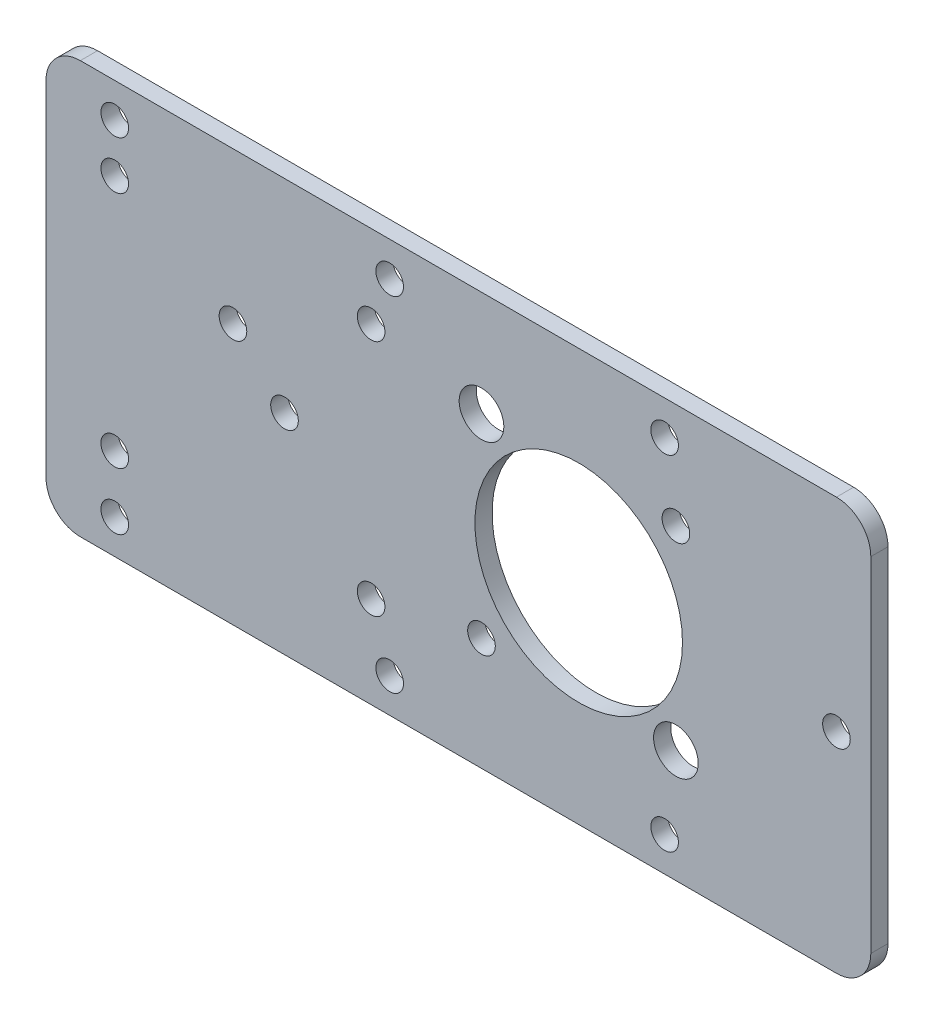
ISO-10303-21;
HEADER;
FILE_DESCRIPTION(('STEP AP214'),'2;1');
FILE_NAME('part.step','',(''),(''),'','','');
FILE_SCHEMA(('AUTOMOTIVE_DESIGN { 1 0 10303 214 1 1 1 1 }'));
ENDSEC;
DATA;
#1=APPLICATION_CONTEXT('core data for automotive mechanical design processes');
#2=APPLICATION_PROTOCOL_DEFINITION('international standard','automotive_design',2000,#1);
#3=PRODUCT_CONTEXT('',#1,'mechanical');
#4=PRODUCT('Part','Part','',(#3));
#5=PRODUCT_RELATED_PRODUCT_CATEGORY('part','',(#4));
#6=PRODUCT_DEFINITION_FORMATION('','',#4);
#7=PRODUCT_DEFINITION_CONTEXT('part definition',#1,'design');
#8=PRODUCT_DEFINITION('design','',#6,#7);
#9=PRODUCT_DEFINITION_SHAPE('','',#8);
#10=(LENGTH_UNIT() NAMED_UNIT(*) SI_UNIT(.MILLI.,.METRE.));
#11=(NAMED_UNIT(*) PLANE_ANGLE_UNIT() SI_UNIT($,.RADIAN.));
#12=(NAMED_UNIT(*) SI_UNIT($,.STERADIAN.) SOLID_ANGLE_UNIT());
#13=UNCERTAINTY_MEASURE_WITH_UNIT(LENGTH_MEASURE(1.E-05),#10,'distance_accuracy_value','');
#14=(GEOMETRIC_REPRESENTATION_CONTEXT(3) GLOBAL_UNCERTAINTY_ASSIGNED_CONTEXT((#13)) GLOBAL_UNIT_ASSIGNED_CONTEXT((#10,
#11,#12)) REPRESENTATION_CONTEXT('',''));
#15=CARTESIAN_POINT('',(0.,0.,0.));
#16=DIRECTION('',(0.,0.,1.));
#17=DIRECTION('',(1.,0.,0.));
#18=AXIS2_PLACEMENT_3D('',#15,#16,#17);
#19=CARTESIAN_POINT('',(-18.4194587961381,9.85973484361682,3.175));
#20=DIRECTION('',(0.,0.,1.));
#21=DIRECTION('',(1.,0.,0.));
#22=AXIS2_PLACEMENT_3D('',#19,#20,#21);
#23=PLANE('',#22);
#24=CARTESIAN_POINT('',(91.6160534460001,24.3331596898449,3.175));
#25=DIRECTION('',(0.,0.,1.));
#26=DIRECTION('',(1.,0.,0.));
#27=AXIS2_PLACEMENT_3D('',#24,#25,#26);
#28=CIRCLE('',#27,4.12749999999999);
#29=CARTESIAN_POINT('',(95.7435534460001,24.3331596898449,3.175));
#30=VERTEX_POINT('',#29);
#31=EDGE_CURVE('E278',#30,#30,#28,.T.);
#32=ORIENTED_EDGE('',*,*,#31,.F.);
#33=EDGE_LOOP('',(#32));
#34=FACE_BOUND('',#33,.T.);
#35=CARTESIAN_POINT('',(55.6950289617236,60.2541841741216,3.175));
#36=DIRECTION('',(0.,0.,1.));
#37=DIRECTION('',(1.,0.,0.));
#38=AXIS2_PLACEMENT_3D('',#35,#36,#37);
#39=CIRCLE('',#38,4.1275);
#40=CARTESIAN_POINT('',(59.8225289617236,60.2541841741216,3.175));
#41=VERTEX_POINT('',#40);
#42=EDGE_CURVE('E266',#41,#41,#39,.T.);
#43=ORIENTED_EDGE('',*,*,#42,.F.);
#44=EDGE_LOOP('',(#43));
#45=FACE_BOUND('',#44,.T.);
#46=CARTESIAN_POINT('',(38.7305412038619,9.85973484361682,3.175));
#47=DIRECTION('',(0.,0.,1.));
#48=DIRECTION('',(1.,0.,0.));
#49=AXIS2_PLACEMENT_3D('',#46,#47,#48);
#50=CIRCLE('',#49,2.5527);
#51=CARTESIAN_POINT('',(41.2832412038619,9.85973484361682,3.175));
#52=VERTEX_POINT('',#51);
#53=EDGE_CURVE('E254',#52,#52,#50,.T.);
#54=ORIENTED_EDGE('',*,*,#53,.F.);
#55=EDGE_LOOP('',(#54));
#56=FACE_BOUND('',#55,.T.);
#57=CARTESIAN_POINT('',(-12.0694587961381,20.4336742758977,3.175));
#58=DIRECTION('',(0.,0.,1.));
#59=DIRECTION('',(1.,0.,0.));
#60=AXIS2_PLACEMENT_3D('',#57,#58,#59);
#61=CIRCLE('',#60,2.5527);
#62=CARTESIAN_POINT('',(-9.51675879613812,20.4336742758977,3.175));
#63=VERTEX_POINT('',#62);
#64=EDGE_CURVE('E242',#63,#63,#61,.T.);
#65=ORIENTED_EDGE('',*,*,#64,.F.);
#66=EDGE_LOOP('',(#65));
#67=FACE_BOUND('',#66,.T.);
#68=CARTESIAN_POINT('',(9.77419288939169,51.7273950078619,3.175));
#69=DIRECTION('',(0.,0.,1.));
#70=DIRECTION('',(1.,0.,0.));
#71=AXIS2_PLACEMENT_3D('',#68,#69,#70);
#72=CIRCLE('',#71,2.5527);
#73=CARTESIAN_POINT('',(12.3268928893917,51.7273950078619,3.175));
#74=VERTEX_POINT('',#73);
#75=EDGE_CURVE('E230',#74,#74,#72,.T.);
#76=ORIENTED_EDGE('',*,*,#75,.F.);
#77=EDGE_LOOP('',(#76));
#78=FACE_BOUND('',#77,.T.);
#79=CARTESIAN_POINT('',(38.7305412038619,73.3597348436168,3.175));
#80=DIRECTION('',(0.,0.,1.));
#81=DIRECTION('',(1.,0.,0.));
#82=AXIS2_PLACEMENT_3D('',#79,#80,#81);
#83=CIRCLE('',#82,2.55269999999999);
#84=CARTESIAN_POINT('',(41.2832412038619,73.3597348436168,3.175));
#85=VERTEX_POINT('',#84);
#86=EDGE_CURVE('E218',#85,#85,#83,.T.);
#87=ORIENTED_EDGE('',*,*,#86,.F.);
#88=EDGE_LOOP('',(#87));
#89=FACE_BOUND('',#88,.T.);
#90=CARTESIAN_POINT('',(-12.0694587961381,64.4273950078619,3.175));
#91=DIRECTION('',(0.,0.,1.));
#92=DIRECTION('',(1.,0.,0.));
#93=AXIS2_PLACEMENT_3D('',#90,#91,#92);
#94=CIRCLE('',#93,2.55269999999999);
#95=CARTESIAN_POINT('',(-9.51675879613813,64.4273950078619,3.175));
#96=VERTEX_POINT('',#95);
#97=EDGE_CURVE('E206',#96,#96,#94,.T.);
#98=ORIENTED_EDGE('',*,*,#97,.F.);
#99=EDGE_LOOP('',(#98));
#100=FACE_BOUND('',#99,.T.);
#101=CARTESIAN_POINT('',(-12.0694587961381,9.85973484361682,3.175));
#102=DIRECTION('',(0.,0.,1.));
#103=DIRECTION('',(1.,0.,0.));
#104=AXIS2_PLACEMENT_3D('',#101,#102,#103);
#105=CIRCLE('',#104,2.5527);
#106=CARTESIAN_POINT('',(-9.51675879613812,9.85973484361682,3.175));
#107=VERTEX_POINT('',#106);
#108=EDGE_CURVE('E194',#107,#107,#105,.T.);
#109=ORIENTED_EDGE('',*,*,#108,.F.);
#110=EDGE_LOOP('',(#109));
#111=FACE_BOUND('',#110,.T.);
#112=CARTESIAN_POINT('',(89.5305412038619,9.85973484361682,3.175));
#113=DIRECTION('',(0.,0.,1.));
#114=DIRECTION('',(1.,0.,0.));
#115=AXIS2_PLACEMENT_3D('',#112,#113,#114);
#116=CIRCLE('',#115,2.55269999999998);
#117=CARTESIAN_POINT('',(92.0832412038618,9.85973484361682,3.175));
#118=VERTEX_POINT('',#117);
#119=EDGE_CURVE('E140',#118,#118,#116,.T.);
#120=ORIENTED_EDGE('',*,*,#119,.F.);
#121=EDGE_LOOP('',(#120));
#122=FACE_BOUND('',#121,.T.);
#123=CARTESIAN_POINT('',(-18.4194587961381,9.85973484361682,3.175));
#124=DIRECTION('',(0.,0.,1.));
#125=DIRECTION('',(1.,0.,0.));
#126=AXIS2_PLACEMENT_3D('',#123,#124,#125);
#127=CIRCLE('',#126,6.35);
#128=CARTESIAN_POINT('',(-24.7694587961381,9.85973484361682,3.175));
#129=VERTEX_POINT('',#128);
#130=CARTESIAN_POINT('',(-18.4194587961381,3.50973484361682,3.175));
#131=VERTEX_POINT('',#130);
#132=EDGE_CURVE('E151',#129,#131,#127,.T.);
#133=ORIENTED_EDGE('',*,*,#132,.T.);
#134=DIRECTION('',(1.,0.,0.));
#135=VECTOR('',#134,1.);
#136=CARTESIAN_POINT('',(-18.4194587961381,3.50973484361682,3.175));
#137=LINE('',#136,#135);
#138=CARTESIAN_POINT('',(121.280541203862,3.50973484361682,3.175));
#139=VERTEX_POINT('',#138);
#140=EDGE_CURVE('E99',#131,#139,#137,.T.);
#141=ORIENTED_EDGE('',*,*,#140,.T.);
#142=CARTESIAN_POINT('',(121.280541203862,9.85973484361682,3.175));
#143=DIRECTION('',(0.,0.,1.));
#144=DIRECTION('',(1.,0.,0.));
#145=AXIS2_PLACEMENT_3D('',#142,#143,#144);
#146=CIRCLE('',#145,6.34999999999999);
#147=CARTESIAN_POINT('',(127.630541203862,9.85973484361682,3.175));
#148=VERTEX_POINT('',#147);
#149=EDGE_CURVE('E166',#139,#148,#146,.T.);
#150=ORIENTED_EDGE('',*,*,#149,.T.);
#151=DIRECTION('',(0.,1.,0.));
#152=VECTOR('',#151,1.);
#153=CARTESIAN_POINT('',(127.630541203862,73.3597348436168,3.175));
#154=LINE('',#153,#152);
#155=CARTESIAN_POINT('',(127.630541203862,73.3597348436168,3.175));
#156=VERTEX_POINT('',#155);
#157=EDGE_CURVE('E179',#148,#156,#154,.T.);
#158=ORIENTED_EDGE('',*,*,#157,.T.);
#159=CARTESIAN_POINT('',(121.280541203862,73.3597348436168,3.175));
#160=DIRECTION('',(0.,0.,1.));
#161=DIRECTION('',(-1.,0.,0.));
#162=AXIS2_PLACEMENT_3D('',#159,#160,#161);
#163=CIRCLE('',#162,6.34999999999999);
#164=CARTESIAN_POINT('',(121.280541203862,79.7097348436168,3.175));
#165=VERTEX_POINT('',#164);
#166=EDGE_CURVE('E118',#156,#165,#163,.T.);
#167=ORIENTED_EDGE('',*,*,#166,.T.);
#168=DIRECTION('',(-1.,0.,0.));
#169=VECTOR('',#168,1.);
#170=CARTESIAN_POINT('',(-18.4194587961381,79.7097348436168,3.175));
#171=LINE('',#170,#169);
#172=CARTESIAN_POINT('',(-18.4194587961381,79.7097348436168,3.175));
#173=VERTEX_POINT('',#172);
#174=EDGE_CURVE('E112',#165,#173,#171,.T.);
#175=ORIENTED_EDGE('',*,*,#174,.T.);
#176=CARTESIAN_POINT('',(-18.4194587961381,73.3597348436168,3.175));
#177=DIRECTION('',(0.,0.,1.));
#178=DIRECTION('',(-1.,0.,0.));
#179=AXIS2_PLACEMENT_3D('',#176,#177,#178);
#180=CIRCLE('',#179,6.35);
#181=CARTESIAN_POINT('',(-24.7694587961381,73.3597348436168,3.175));
#182=VERTEX_POINT('',#181);
#183=EDGE_CURVE('E116',#173,#182,#180,.T.);
#184=ORIENTED_EDGE('',*,*,#183,.T.);
#185=DIRECTION('',(0.,-1.,0.));
#186=VECTOR('',#185,1.);
#187=CARTESIAN_POINT('',(-24.7694587961381,9.85973484361682,3.175));
#188=LINE('',#187,#186);
#189=EDGE_CURVE('E56',#182,#129,#188,.T.);
#190=ORIENTED_EDGE('',*,*,#189,.T.);
#191=EDGE_LOOP('',(#133,#141,#150,#158,#167,#175,#184,#190));
#192=FACE_BOUND('',#191,.T.);
#193=CARTESIAN_POINT('',(-12.0694587961381,73.3597348436168,3.175));
#194=DIRECTION('',(0.,0.,1.));
#195=DIRECTION('',(1.,0.,0.));
#196=AXIS2_PLACEMENT_3D('',#193,#194,#195);
#197=CIRCLE('',#196,2.55269999999998);
#198=CARTESIAN_POINT('',(-9.51675879613814,73.3597348436168,3.175));
#199=VERTEX_POINT('',#198);
#200=EDGE_CURVE('E188',#199,#199,#197,.T.);
#201=ORIENTED_EDGE('',*,*,#200,.F.);
#202=EDGE_LOOP('',(#201));
#203=FACE_BOUND('',#202,.T.);
#204=CARTESIAN_POINT('',(89.5305412038619,73.3597348436168,3.175));
#205=DIRECTION('',(0.,0.,1.));
#206=DIRECTION('',(1.,0.,0.));
#207=AXIS2_PLACEMENT_3D('',#204,#205,#206);
#208=CIRCLE('',#207,2.55269999999998);
#209=CARTESIAN_POINT('',(92.0832412038618,73.3597348436168,3.175));
#210=VERTEX_POINT('',#209);
#211=EDGE_CURVE('E200',#210,#210,#208,.T.);
#212=ORIENTED_EDGE('',*,*,#211,.F.);
#213=EDGE_LOOP('',(#212));
#214=FACE_BOUND('',#213,.T.);
#215=CARTESIAN_POINT('',(121.280541203862,42.2023950078619,3.175));
#216=DIRECTION('',(0.,0.,1.));
#217=DIRECTION('',(1.,0.,0.));
#218=AXIS2_PLACEMENT_3D('',#215,#216,#217);
#219=CIRCLE('',#218,2.55270000000001);
#220=CARTESIAN_POINT('',(123.833241203862,42.2023950078619,3.175));
#221=VERTEX_POINT('',#220);
#222=EDGE_CURVE('E212',#221,#221,#219,.T.);
#223=ORIENTED_EDGE('',*,*,#222,.F.);
#224=EDGE_LOOP('',(#223));
#225=FACE_BOUND('',#224,.T.);
#226=CARTESIAN_POINT('',(35.3015412038619,64.4273950078619,3.175));
#227=DIRECTION('',(0.,0.,1.));
#228=DIRECTION('',(1.,0.,0.));
#229=AXIS2_PLACEMENT_3D('',#226,#227,#228);
#230=CIRCLE('',#229,2.5527);
#231=CARTESIAN_POINT('',(37.8542412038619,64.4273950078619,3.175));
#232=VERTEX_POINT('',#231);
#233=EDGE_CURVE('E224',#232,#232,#230,.T.);
#234=ORIENTED_EDGE('',*,*,#233,.F.);
#235=EDGE_LOOP('',(#234));
#236=FACE_BOUND('',#235,.T.);
#237=CARTESIAN_POINT('',(19.2991928893917,42.2023950078619,3.175));
#238=DIRECTION('',(0.,0.,1.));
#239=DIRECTION('',(1.,0.,0.));
#240=AXIS2_PLACEMENT_3D('',#237,#238,#239);
#241=CIRCLE('',#240,2.5527);
#242=CARTESIAN_POINT('',(21.8518928893917,42.2023950078619,3.175));
#243=VERTEX_POINT('',#242);
#244=EDGE_CURVE('E236',#243,#243,#241,.T.);
#245=ORIENTED_EDGE('',*,*,#244,.F.);
#246=EDGE_LOOP('',(#245));
#247=FACE_BOUND('',#246,.T.);
#248=CARTESIAN_POINT('',(35.3015412038619,20.4336742758977,3.175));
#249=DIRECTION('',(0.,0.,1.));
#250=DIRECTION('',(1.,0.,0.));
#251=AXIS2_PLACEMENT_3D('',#248,#249,#250);
#252=CIRCLE('',#251,2.5527);
#253=CARTESIAN_POINT('',(37.8542412038619,20.4336742758977,3.175));
#254=VERTEX_POINT('',#253);
#255=EDGE_CURVE('E248',#254,#254,#252,.T.);
#256=ORIENTED_EDGE('',*,*,#255,.F.);
#257=EDGE_LOOP('',(#256));
#258=FACE_BOUND('',#257,.T.);
#259=CARTESIAN_POINT('',(55.6950289617236,24.3331596898449,3.175));
#260=DIRECTION('',(0.,0.,1.));
#261=DIRECTION('',(1.,0.,0.));
#262=AXIS2_PLACEMENT_3D('',#259,#260,#261);
#263=CIRCLE('',#262,2.5527);
#264=CARTESIAN_POINT('',(58.2477289617236,24.3331596898449,3.175));
#265=VERTEX_POINT('',#264);
#266=EDGE_CURVE('E260',#265,#265,#263,.T.);
#267=ORIENTED_EDGE('',*,*,#266,.F.);
#268=EDGE_LOOP('',(#267));
#269=FACE_BOUND('',#268,.T.);
#270=CARTESIAN_POINT('',(91.6160534460001,60.2541841741216,3.175));
#271=DIRECTION('',(0.,0.,1.));
#272=DIRECTION('',(1.,0.,0.));
#273=AXIS2_PLACEMENT_3D('',#270,#271,#272);
#274=CIRCLE('',#273,2.5527);
#275=CARTESIAN_POINT('',(94.1687534460001,60.2541841741216,3.175));
#276=VERTEX_POINT('',#275);
#277=EDGE_CURVE('E272',#276,#276,#274,.T.);
#278=ORIENTED_EDGE('',*,*,#277,.F.);
#279=EDGE_LOOP('',(#278));
#280=FACE_BOUND('',#279,.T.);
#281=CARTESIAN_POINT('',(73.6555412038619,42.2023950078619,3.175));
#282=DIRECTION('',(0.,0.,1.));
#283=DIRECTION('',(1.,0.,0.));
#284=AXIS2_PLACEMENT_3D('',#281,#282,#283);
#285=CIRCLE('',#284,19.177);
#286=CARTESIAN_POINT('',(92.8325412038619,42.2023950078619,3.175));
#287=VERTEX_POINT('',#286);
#288=EDGE_CURVE('E284',#287,#287,#285,.T.);
#289=ORIENTED_EDGE('',*,*,#288,.F.);
#290=EDGE_LOOP('',(#289));
#291=FACE_BOUND('',#290,.T.);
#292=ADVANCED_FACE('F39',(#34,#45,#56,#67,#78,#89,#100,#111,#122,#192,#203,#214,#225,#236,#247,
#258,#269,#280,#291),#23,.T.);
#293=CARTESIAN_POINT('',(-18.4194587961381,9.85973484361682,0.));
#294=DIRECTION('',(0.,0.,1.));
#295=DIRECTION('',(1.,0.,0.));
#296=AXIS2_PLACEMENT_3D('',#293,#294,#295);
#297=PLANE('',#296);
#298=CARTESIAN_POINT('',(-18.4194587961381,9.85973484361682,0.));
#299=DIRECTION('',(0.,0.,1.));
#300=DIRECTION('',(1.,0.,0.));
#301=AXIS2_PLACEMENT_3D('',#298,#299,#300);
#302=CIRCLE('',#301,6.35);
#303=CARTESIAN_POINT('',(-24.7694587961381,9.85973484361682,0.));
#304=VERTEX_POINT('',#303);
#305=CARTESIAN_POINT('',(-18.4194587961381,3.50973484361682,0.));
#306=VERTEX_POINT('',#305);
#307=EDGE_CURVE('E136',#304,#306,#302,.T.);
#308=ORIENTED_EDGE('',*,*,#307,.F.);
#309=DIRECTION('',(0.,-1.,0.));
#310=VECTOR('',#309,1.);
#311=CARTESIAN_POINT('',(-24.7694587961381,9.85973484361682,0.));
#312=LINE('',#311,#310);
#313=CARTESIAN_POINT('',(-24.7694587961381,73.3597348436168,0.));
#314=VERTEX_POINT('',#313);
#315=EDGE_CURVE('E91',#314,#304,#312,.T.);
#316=ORIENTED_EDGE('',*,*,#315,.F.);
#317=CARTESIAN_POINT('',(-18.4194587961381,73.3597348436168,0.));
#318=DIRECTION('',(0.,0.,1.));
#319=DIRECTION('',(-1.,0.,0.));
#320=AXIS2_PLACEMENT_3D('',#317,#318,#319);
#321=CIRCLE('',#320,6.35);
#322=CARTESIAN_POINT('',(-18.4194587961381,79.7097348436168,0.));
#323=VERTEX_POINT('',#322);
#324=EDGE_CURVE('E85',#323,#314,#321,.T.);
#325=ORIENTED_EDGE('',*,*,#324,.F.);
#326=DIRECTION('',(-1.,0.,0.));
#327=VECTOR('',#326,1.);
#328=CARTESIAN_POINT('',(-18.4194587961381,79.7097348436168,0.));
#329=LINE('',#328,#327);
#330=CARTESIAN_POINT('',(121.280541203862,79.7097348436168,0.));
#331=VERTEX_POINT('',#330);
#332=EDGE_CURVE('E126',#331,#323,#329,.T.);
#333=ORIENTED_EDGE('',*,*,#332,.F.);
#334=CARTESIAN_POINT('',(121.280541203862,73.3597348436168,0.));
#335=DIRECTION('',(0.,0.,1.));
#336=DIRECTION('',(-1.,0.,0.));
#337=AXIS2_PLACEMENT_3D('',#334,#335,#336);
#338=CIRCLE('',#337,6.34999999999999);
#339=CARTESIAN_POINT('',(127.630541203862,73.3597348436168,0.));
#340=VERTEX_POINT('',#339);
#341=EDGE_CURVE('E146',#340,#331,#338,.T.);
#342=ORIENTED_EDGE('',*,*,#341,.F.);
#343=DIRECTION('',(0.,1.,0.));
#344=VECTOR('',#343,1.);
#345=CARTESIAN_POINT('',(127.630541203862,73.3597348436168,0.));
#346=LINE('',#345,#344);
#347=CARTESIAN_POINT('',(127.630541203862,9.85973484361682,0.));
#348=VERTEX_POINT('',#347);
#349=EDGE_CURVE('E144',#348,#340,#346,.T.);
#350=ORIENTED_EDGE('',*,*,#349,.F.);
#351=CARTESIAN_POINT('',(121.280541203862,9.85973484361682,0.));
#352=DIRECTION('',(0.,0.,1.));
#353=DIRECTION('',(1.,0.,0.));
#354=AXIS2_PLACEMENT_3D('',#351,#352,#353);
#355=CIRCLE('',#354,6.34999999999999);
#356=CARTESIAN_POINT('',(121.280541203862,3.50973484361682,0.));
#357=VERTEX_POINT('',#356);
#358=EDGE_CURVE('E142',#357,#348,#355,.T.);
#359=ORIENTED_EDGE('',*,*,#358,.F.);
#360=DIRECTION('',(1.,0.,0.));
#361=VECTOR('',#360,1.);
#362=CARTESIAN_POINT('',(-18.4194587961381,3.50973484361682,0.));
#363=LINE('',#362,#361);
#364=EDGE_CURVE('E139',#306,#357,#363,.T.);
#365=ORIENTED_EDGE('',*,*,#364,.F.);
#366=EDGE_LOOP('',(#308,#316,#325,#333,#342,#350,#359,#365));
#367=FACE_BOUND('',#366,.T.);
#368=CARTESIAN_POINT('',(89.5305412038619,9.85973484361682,0.));
#369=DIRECTION('',(0.,0.,1.));
#370=DIRECTION('',(1.,0.,0.));
#371=AXIS2_PLACEMENT_3D('',#368,#369,#370);
#372=CIRCLE('',#371,2.55269999999998);
#373=CARTESIAN_POINT('',(92.0832412038618,9.85973484361682,0.));
#374=VERTEX_POINT('',#373);
#375=EDGE_CURVE('E185',#374,#374,#372,.T.);
#376=ORIENTED_EDGE('',*,*,#375,.T.);
#377=EDGE_LOOP('',(#376));
#378=FACE_BOUND('',#377,.T.);
#379=CARTESIAN_POINT('',(-12.0694587961381,73.3597348436168,0.));
#380=DIRECTION('',(0.,0.,1.));
#381=DIRECTION('',(1.,0.,0.));
#382=AXIS2_PLACEMENT_3D('',#379,#380,#381);
#383=CIRCLE('',#382,2.55269999999998);
#384=CARTESIAN_POINT('',(-9.51675879613814,73.3597348436168,0.));
#385=VERTEX_POINT('',#384);
#386=EDGE_CURVE('E191',#385,#385,#383,.T.);
#387=ORIENTED_EDGE('',*,*,#386,.T.);
#388=EDGE_LOOP('',(#387));
#389=FACE_BOUND('',#388,.T.);
#390=CARTESIAN_POINT('',(-12.0694587961381,9.85973484361682,0.));
#391=DIRECTION('',(0.,0.,1.));
#392=DIRECTION('',(1.,0.,0.));
#393=AXIS2_PLACEMENT_3D('',#390,#391,#392);
#394=CIRCLE('',#393,2.5527);
#395=CARTESIAN_POINT('',(-9.51675879613812,9.85973484361682,0.));
#396=VERTEX_POINT('',#395);
#397=EDGE_CURVE('E197',#396,#396,#394,.T.);
#398=ORIENTED_EDGE('',*,*,#397,.T.);
#399=EDGE_LOOP('',(#398));
#400=FACE_BOUND('',#399,.T.);
#401=CARTESIAN_POINT('',(89.5305412038619,73.3597348436168,0.));
#402=DIRECTION('',(0.,0.,1.));
#403=DIRECTION('',(1.,0.,0.));
#404=AXIS2_PLACEMENT_3D('',#401,#402,#403);
#405=CIRCLE('',#404,2.55269999999998);
#406=CARTESIAN_POINT('',(92.0832412038618,73.3597348436168,0.));
#407=VERTEX_POINT('',#406);
#408=EDGE_CURVE('E203',#407,#407,#405,.T.);
#409=ORIENTED_EDGE('',*,*,#408,.T.);
#410=EDGE_LOOP('',(#409));
#411=FACE_BOUND('',#410,.T.);
#412=CARTESIAN_POINT('',(-12.0694587961381,64.4273950078619,0.));
#413=DIRECTION('',(0.,0.,1.));
#414=DIRECTION('',(1.,0.,0.));
#415=AXIS2_PLACEMENT_3D('',#412,#413,#414);
#416=CIRCLE('',#415,2.55269999999999);
#417=CARTESIAN_POINT('',(-9.51675879613813,64.4273950078619,0.));
#418=VERTEX_POINT('',#417);
#419=EDGE_CURVE('E209',#418,#418,#416,.T.);
#420=ORIENTED_EDGE('',*,*,#419,.T.);
#421=EDGE_LOOP('',(#420));
#422=FACE_BOUND('',#421,.T.);
#423=CARTESIAN_POINT('',(121.280541203862,42.2023950078619,0.));
#424=DIRECTION('',(0.,0.,1.));
#425=DIRECTION('',(1.,0.,0.));
#426=AXIS2_PLACEMENT_3D('',#423,#424,#425);
#427=CIRCLE('',#426,2.55270000000001);
#428=CARTESIAN_POINT('',(123.833241203862,42.2023950078619,0.));
#429=VERTEX_POINT('',#428);
#430=EDGE_CURVE('E215',#429,#429,#427,.T.);
#431=ORIENTED_EDGE('',*,*,#430,.T.);
#432=EDGE_LOOP('',(#431));
#433=FACE_BOUND('',#432,.T.);
#434=CARTESIAN_POINT('',(38.7305412038619,73.3597348436168,0.));
#435=DIRECTION('',(0.,0.,1.));
#436=DIRECTION('',(1.,0.,0.));
#437=AXIS2_PLACEMENT_3D('',#434,#435,#436);
#438=CIRCLE('',#437,2.55269999999999);
#439=CARTESIAN_POINT('',(41.2832412038619,73.3597348436168,0.));
#440=VERTEX_POINT('',#439);
#441=EDGE_CURVE('E221',#440,#440,#438,.T.);
#442=ORIENTED_EDGE('',*,*,#441,.T.);
#443=EDGE_LOOP('',(#442));
#444=FACE_BOUND('',#443,.T.);
#445=CARTESIAN_POINT('',(35.3015412038619,64.4273950078619,0.));
#446=DIRECTION('',(0.,0.,1.));
#447=DIRECTION('',(1.,0.,0.));
#448=AXIS2_PLACEMENT_3D('',#445,#446,#447);
#449=CIRCLE('',#448,2.5527);
#450=CARTESIAN_POINT('',(37.8542412038619,64.4273950078619,0.));
#451=VERTEX_POINT('',#450);
#452=EDGE_CURVE('E227',#451,#451,#449,.T.);
#453=ORIENTED_EDGE('',*,*,#452,.T.);
#454=EDGE_LOOP('',(#453));
#455=FACE_BOUND('',#454,.T.);
#456=CARTESIAN_POINT('',(9.77419288939169,51.7273950078619,0.));
#457=DIRECTION('',(0.,0.,1.));
#458=DIRECTION('',(1.,0.,0.));
#459=AXIS2_PLACEMENT_3D('',#456,#457,#458);
#460=CIRCLE('',#459,2.5527);
#461=CARTESIAN_POINT('',(12.3268928893917,51.7273950078619,0.));
#462=VERTEX_POINT('',#461);
#463=EDGE_CURVE('E233',#462,#462,#460,.T.);
#464=ORIENTED_EDGE('',*,*,#463,.T.);
#465=EDGE_LOOP('',(#464));
#466=FACE_BOUND('',#465,.T.);
#467=CARTESIAN_POINT('',(19.2991928893917,42.2023950078619,0.));
#468=DIRECTION('',(0.,0.,1.));
#469=DIRECTION('',(1.,0.,0.));
#470=AXIS2_PLACEMENT_3D('',#467,#468,#469);
#471=CIRCLE('',#470,2.5527);
#472=CARTESIAN_POINT('',(21.8518928893917,42.2023950078619,0.));
#473=VERTEX_POINT('',#472);
#474=EDGE_CURVE('E239',#473,#473,#471,.T.);
#475=ORIENTED_EDGE('',*,*,#474,.T.);
#476=EDGE_LOOP('',(#475));
#477=FACE_BOUND('',#476,.T.);
#478=CARTESIAN_POINT('',(-12.0694587961381,20.4336742758977,0.));
#479=DIRECTION('',(0.,0.,1.));
#480=DIRECTION('',(1.,0.,0.));
#481=AXIS2_PLACEMENT_3D('',#478,#479,#480);
#482=CIRCLE('',#481,2.5527);
#483=CARTESIAN_POINT('',(-9.51675879613812,20.4336742758977,0.));
#484=VERTEX_POINT('',#483);
#485=EDGE_CURVE('E245',#484,#484,#482,.T.);
#486=ORIENTED_EDGE('',*,*,#485,.T.);
#487=EDGE_LOOP('',(#486));
#488=FACE_BOUND('',#487,.T.);
#489=CARTESIAN_POINT('',(35.3015412038619,20.4336742758977,0.));
#490=DIRECTION('',(0.,0.,1.));
#491=DIRECTION('',(1.,0.,0.));
#492=AXIS2_PLACEMENT_3D('',#489,#490,#491);
#493=CIRCLE('',#492,2.5527);
#494=CARTESIAN_POINT('',(37.8542412038619,20.4336742758977,0.));
#495=VERTEX_POINT('',#494);
#496=EDGE_CURVE('E251',#495,#495,#493,.T.);
#497=ORIENTED_EDGE('',*,*,#496,.T.);
#498=EDGE_LOOP('',(#497));
#499=FACE_BOUND('',#498,.T.);
#500=CARTESIAN_POINT('',(38.7305412038619,9.85973484361682,0.));
#501=DIRECTION('',(0.,0.,1.));
#502=DIRECTION('',(1.,0.,0.));
#503=AXIS2_PLACEMENT_3D('',#500,#501,#502);
#504=CIRCLE('',#503,2.5527);
#505=CARTESIAN_POINT('',(41.2832412038619,9.85973484361682,0.));
#506=VERTEX_POINT('',#505);
#507=EDGE_CURVE('E257',#506,#506,#504,.T.);
#508=ORIENTED_EDGE('',*,*,#507,.T.);
#509=EDGE_LOOP('',(#508));
#510=FACE_BOUND('',#509,.T.);
#511=CARTESIAN_POINT('',(55.6950289617236,24.3331596898449,0.));
#512=DIRECTION('',(0.,0.,1.));
#513=DIRECTION('',(1.,0.,0.));
#514=AXIS2_PLACEMENT_3D('',#511,#512,#513);
#515=CIRCLE('',#514,2.5527);
#516=CARTESIAN_POINT('',(58.2477289617236,24.3331596898449,0.));
#517=VERTEX_POINT('',#516);
#518=EDGE_CURVE('E263',#517,#517,#515,.T.);
#519=ORIENTED_EDGE('',*,*,#518,.T.);
#520=EDGE_LOOP('',(#519));
#521=FACE_BOUND('',#520,.T.);
#522=CARTESIAN_POINT('',(55.6950289617236,60.2541841741216,0.));
#523=DIRECTION('',(0.,0.,1.));
#524=DIRECTION('',(1.,0.,0.));
#525=AXIS2_PLACEMENT_3D('',#522,#523,#524);
#526=CIRCLE('',#525,4.1275);
#527=CARTESIAN_POINT('',(59.8225289617236,60.2541841741216,0.));
#528=VERTEX_POINT('',#527);
#529=EDGE_CURVE('E269',#528,#528,#526,.T.);
#530=ORIENTED_EDGE('',*,*,#529,.T.);
#531=EDGE_LOOP('',(#530));
#532=FACE_BOUND('',#531,.T.);
#533=CARTESIAN_POINT('',(91.6160534460001,60.2541841741216,0.));
#534=DIRECTION('',(0.,0.,1.));
#535=DIRECTION('',(1.,0.,0.));
#536=AXIS2_PLACEMENT_3D('',#533,#534,#535);
#537=CIRCLE('',#536,2.5527);
#538=CARTESIAN_POINT('',(94.1687534460001,60.2541841741216,0.));
#539=VERTEX_POINT('',#538);
#540=EDGE_CURVE('E275',#539,#539,#537,.T.);
#541=ORIENTED_EDGE('',*,*,#540,.T.);
#542=EDGE_LOOP('',(#541));
#543=FACE_BOUND('',#542,.T.);
#544=CARTESIAN_POINT('',(91.6160534460001,24.3331596898449,0.));
#545=DIRECTION('',(0.,0.,1.));
#546=DIRECTION('',(1.,0.,0.));
#547=AXIS2_PLACEMENT_3D('',#544,#545,#546);
#548=CIRCLE('',#547,4.12749999999999);
#549=CARTESIAN_POINT('',(95.7435534460001,24.3331596898449,0.));
#550=VERTEX_POINT('',#549);
#551=EDGE_CURVE('E281',#550,#550,#548,.T.);
#552=ORIENTED_EDGE('',*,*,#551,.T.);
#553=EDGE_LOOP('',(#552));
#554=FACE_BOUND('',#553,.T.);
#555=CARTESIAN_POINT('',(73.6555412038619,42.2023950078619,0.));
#556=DIRECTION('',(0.,0.,1.));
#557=DIRECTION('',(1.,0.,0.));
#558=AXIS2_PLACEMENT_3D('',#555,#556,#557);
#559=CIRCLE('',#558,19.177);
#560=CARTESIAN_POINT('',(92.8325412038619,42.2023950078619,0.));
#561=VERTEX_POINT('',#560);
#562=EDGE_CURVE('E287',#561,#561,#559,.T.);
#563=ORIENTED_EDGE('',*,*,#562,.T.);
#564=EDGE_LOOP('',(#563));
#565=FACE_BOUND('',#564,.T.);
#566=ADVANCED_FACE('F170',(#367,#378,#389,#400,#411,#422,#433,#444,#455,#466,#477,#488,#499,
#510,#521,#532,#543,#554,#565),#297,.F.);
#567=CARTESIAN_POINT('',(-18.4194587961381,9.85973484361682,3.175));
#568=DIRECTION('',(0.,0.,-1.));
#569=DIRECTION('',(-1.,0.,0.));
#570=AXIS2_PLACEMENT_3D('',#567,#568,#569);
#571=CYLINDRICAL_SURFACE('',#570,6.35);
#572=ORIENTED_EDGE('',*,*,#307,.T.);
#573=DIRECTION('',(0.,0.,-1.));
#574=VECTOR('',#573,1.);
#575=CARTESIAN_POINT('',(-18.4194587961381,3.50973484361682,3.175));
#576=LINE('',#575,#574);
#577=EDGE_CURVE('E11',#131,#306,#576,.T.);
#578=ORIENTED_EDGE('',*,*,#577,.F.);
#579=ORIENTED_EDGE('',*,*,#132,.F.);
#580=DIRECTION('',(0.,0.,-1.));
#581=VECTOR('',#580,1.);
#582=CARTESIAN_POINT('',(-24.7694587961381,9.85973484361682,3.175));
#583=LINE('',#582,#581);
#584=EDGE_CURVE('E132',#129,#304,#583,.T.);
#585=ORIENTED_EDGE('',*,*,#584,.T.);
#586=EDGE_LOOP('',(#572,#578,#579,#585));
#587=FACE_BOUND('',#586,.T.);
#588=ADVANCED_FACE('F41',(#587),#571,.T.);
#589=CARTESIAN_POINT('',(-18.4194587961381,3.50973484361682,3.175));
#590=DIRECTION('',(0.,1.,0.));
#591=DIRECTION('',(0.,0.,1.));
#592=AXIS2_PLACEMENT_3D('',#589,#590,#591);
#593=PLANE('',#592);
#594=ORIENTED_EDGE('',*,*,#364,.T.);
#595=DIRECTION('',(0.,0.,-1.));
#596=VECTOR('',#595,1.);
#597=CARTESIAN_POINT('',(121.280541203862,3.50973484361682,3.175));
#598=LINE('',#597,#596);
#599=EDGE_CURVE('E48',#139,#357,#598,.T.);
#600=ORIENTED_EDGE('',*,*,#599,.F.);
#601=ORIENTED_EDGE('',*,*,#140,.F.);
#602=ORIENTED_EDGE('',*,*,#577,.T.);
#603=EDGE_LOOP('',(#594,#600,#601,#602));
#604=FACE_BOUND('',#603,.T.);
#605=ADVANCED_FACE('F321',(#604),#593,.F.);
#606=CARTESIAN_POINT('',(121.280541203862,9.85973484361682,3.175));
#607=DIRECTION('',(0.,0.,-1.));
#608=DIRECTION('',(-1.,0.,0.));
#609=AXIS2_PLACEMENT_3D('',#606,#607,#608);
#610=CYLINDRICAL_SURFACE('',#609,6.34999999999999);
#611=ORIENTED_EDGE('',*,*,#358,.T.);
#612=DIRECTION('',(0.,0.,-1.));
#613=VECTOR('',#612,1.);
#614=CARTESIAN_POINT('',(127.630541203862,9.85973484361682,3.175));
#615=LINE('',#614,#613);
#616=EDGE_CURVE('E158',#148,#348,#615,.T.);
#617=ORIENTED_EDGE('',*,*,#616,.F.);
#618=ORIENTED_EDGE('',*,*,#149,.F.);
#619=ORIENTED_EDGE('',*,*,#599,.T.);
#620=EDGE_LOOP('',(#611,#617,#618,#619));
#621=FACE_BOUND('',#620,.T.);
#622=ADVANCED_FACE('F164',(#621),#610,.T.);
#623=CARTESIAN_POINT('',(127.630541203862,73.3597348436168,3.175));
#624=DIRECTION('',(-1.,0.,0.));
#625=DIRECTION('',(0.,0.,1.));
#626=AXIS2_PLACEMENT_3D('',#623,#624,#625);
#627=PLANE('',#626);
#628=ORIENTED_EDGE('',*,*,#349,.T.);
#629=DIRECTION('',(0.,0.,-1.));
#630=VECTOR('',#629,1.);
#631=CARTESIAN_POINT('',(127.630541203862,73.3597348436168,3.175));
#632=LINE('',#631,#630);
#633=EDGE_CURVE('E155',#156,#340,#632,.T.);
#634=ORIENTED_EDGE('',*,*,#633,.F.);
#635=ORIENTED_EDGE('',*,*,#157,.F.);
#636=ORIENTED_EDGE('',*,*,#616,.T.);
#637=EDGE_LOOP('',(#628,#634,#635,#636));
#638=FACE_BOUND('',#637,.T.);
#639=ADVANCED_FACE('F175',(#638),#627,.F.);
#640=CARTESIAN_POINT('',(121.280541203862,73.3597348436168,3.175));
#641=DIRECTION('',(0.,0.,-1.));
#642=DIRECTION('',(-1.,0.,0.));
#643=AXIS2_PLACEMENT_3D('',#640,#641,#642);
#644=CYLINDRICAL_SURFACE('',#643,6.34999999999999);
#645=ORIENTED_EDGE('',*,*,#341,.T.);
#646=DIRECTION('',(0.,0.,-1.));
#647=VECTOR('',#646,1.);
#648=CARTESIAN_POINT('',(121.280541203862,79.7097348436168,3.175));
#649=LINE('',#648,#647);
#650=EDGE_CURVE('E127',#165,#331,#649,.T.);
#651=ORIENTED_EDGE('',*,*,#650,.F.);
#652=ORIENTED_EDGE('',*,*,#166,.F.);
#653=ORIENTED_EDGE('',*,*,#633,.T.);
#654=EDGE_LOOP('',(#645,#651,#652,#653));
#655=FACE_BOUND('',#654,.T.);
#656=ADVANCED_FACE('F178',(#655),#644,.T.);
#657=CARTESIAN_POINT('',(-18.4194587961381,79.7097348436168,3.175));
#658=DIRECTION('',(0.,-1.,0.));
#659=DIRECTION('',(0.,0.,-1.));
#660=AXIS2_PLACEMENT_3D('',#657,#658,#659);
#661=PLANE('',#660);
#662=ORIENTED_EDGE('',*,*,#332,.T.);
#663=DIRECTION('',(0.,0.,-1.));
#664=VECTOR('',#663,1.);
#665=CARTESIAN_POINT('',(-18.4194587961381,79.7097348436168,3.175));
#666=LINE('',#665,#664);
#667=EDGE_CURVE('E123',#173,#323,#666,.T.);
#668=ORIENTED_EDGE('',*,*,#667,.F.);
#669=ORIENTED_EDGE('',*,*,#174,.F.);
#670=ORIENTED_EDGE('',*,*,#650,.T.);
#671=EDGE_LOOP('',(#662,#668,#669,#670));
#672=FACE_BOUND('',#671,.T.);
#673=ADVANCED_FACE('F124',(#672),#661,.F.);
#674=CARTESIAN_POINT('',(-18.4194587961381,73.3597348436168,3.175));
#675=DIRECTION('',(0.,0.,-1.));
#676=DIRECTION('',(-1.,0.,0.));
#677=AXIS2_PLACEMENT_3D('',#674,#675,#676);
#678=CYLINDRICAL_SURFACE('',#677,6.35);
#679=ORIENTED_EDGE('',*,*,#324,.T.);
#680=DIRECTION('',(0.,0.,-1.));
#681=VECTOR('',#680,1.);
#682=CARTESIAN_POINT('',(-24.7694587961381,73.3597348436168,3.175));
#683=LINE('',#682,#681);
#684=EDGE_CURVE('E128',#182,#314,#683,.T.);
#685=ORIENTED_EDGE('',*,*,#684,.F.);
#686=ORIENTED_EDGE('',*,*,#183,.F.);
#687=ORIENTED_EDGE('',*,*,#667,.T.);
#688=EDGE_LOOP('',(#679,#685,#686,#687));
#689=FACE_BOUND('',#688,.T.);
#690=ADVANCED_FACE('F130',(#689),#678,.T.);
#691=CARTESIAN_POINT('',(-24.7694587961381,9.85973484361682,3.175));
#692=DIRECTION('',(1.,0.,0.));
#693=DIRECTION('',(0.,0.,-1.));
#694=AXIS2_PLACEMENT_3D('',#691,#692,#693);
#695=PLANE('',#694);
#696=ORIENTED_EDGE('',*,*,#315,.T.);
#697=ORIENTED_EDGE('',*,*,#584,.F.);
#698=ORIENTED_EDGE('',*,*,#189,.F.);
#699=ORIENTED_EDGE('',*,*,#684,.T.);
#700=EDGE_LOOP('',(#696,#697,#698,#699));
#701=FACE_BOUND('',#700,.T.);
#702=ADVANCED_FACE('F309',(#701),#695,.F.);
#703=CARTESIAN_POINT('',(89.5305412038619,9.85973484361682,3.175));
#704=DIRECTION('',(0.,0.,-1.));
#705=DIRECTION('',(-1.,0.,0.));
#706=AXIS2_PLACEMENT_3D('',#703,#704,#705);
#707=CYLINDRICAL_SURFACE('',#706,2.55269999999998);
#708=ORIENTED_EDGE('',*,*,#119,.T.);
#709=EDGE_LOOP('',(#708));
#710=FACE_BOUND('',#709,.T.);
#711=ORIENTED_EDGE('',*,*,#375,.F.);
#712=EDGE_LOOP('',(#711));
#713=FACE_BOUND('',#712,.T.);
#714=ADVANCED_FACE('F306',(#710,#713),#707,.F.);
#715=CARTESIAN_POINT('',(-12.0694587961381,73.3597348436168,3.175));
#716=DIRECTION('',(0.,0.,-1.));
#717=DIRECTION('',(-1.,0.,0.));
#718=AXIS2_PLACEMENT_3D('',#715,#716,#717);
#719=CYLINDRICAL_SURFACE('',#718,2.55269999999998);
#720=ORIENTED_EDGE('',*,*,#200,.T.);
#721=EDGE_LOOP('',(#720));
#722=FACE_BOUND('',#721,.T.);
#723=ORIENTED_EDGE('',*,*,#386,.F.);
#724=EDGE_LOOP('',(#723));
#725=FACE_BOUND('',#724,.T.);
#726=ADVANCED_FACE('F384',(#722,#725),#719,.F.);
#727=CARTESIAN_POINT('',(-12.0694587961381,9.85973484361682,3.175));
#728=DIRECTION('',(0.,0.,-1.));
#729=DIRECTION('',(-1.,0.,0.));
#730=AXIS2_PLACEMENT_3D('',#727,#728,#729);
#731=CYLINDRICAL_SURFACE('',#730,2.5527);
#732=ORIENTED_EDGE('',*,*,#108,.T.);
#733=EDGE_LOOP('',(#732));
#734=FACE_BOUND('',#733,.T.);
#735=ORIENTED_EDGE('',*,*,#397,.F.);
#736=EDGE_LOOP('',(#735));
#737=FACE_BOUND('',#736,.T.);
#738=ADVANCED_FACE('F392',(#734,#737),#731,.F.);
#739=CARTESIAN_POINT('',(89.5305412038619,73.3597348436168,3.175));
#740=DIRECTION('',(0.,0.,-1.));
#741=DIRECTION('',(-1.,0.,0.));
#742=AXIS2_PLACEMENT_3D('',#739,#740,#741);
#743=CYLINDRICAL_SURFACE('',#742,2.55269999999998);
#744=ORIENTED_EDGE('',*,*,#211,.T.);
#745=EDGE_LOOP('',(#744));
#746=FACE_BOUND('',#745,.T.);
#747=ORIENTED_EDGE('',*,*,#408,.F.);
#748=EDGE_LOOP('',(#747));
#749=FACE_BOUND('',#748,.T.);
#750=ADVANCED_FACE('F400',(#746,#749),#743,.F.);
#751=CARTESIAN_POINT('',(-12.0694587961381,64.4273950078619,3.175));
#752=DIRECTION('',(0.,0.,-1.));
#753=DIRECTION('',(-1.,0.,0.));
#754=AXIS2_PLACEMENT_3D('',#751,#752,#753);
#755=CYLINDRICAL_SURFACE('',#754,2.55269999999999);
#756=ORIENTED_EDGE('',*,*,#97,.T.);
#757=EDGE_LOOP('',(#756));
#758=FACE_BOUND('',#757,.T.);
#759=ORIENTED_EDGE('',*,*,#419,.F.);
#760=EDGE_LOOP('',(#759));
#761=FACE_BOUND('',#760,.T.);
#762=ADVANCED_FACE('F409',(#758,#761),#755,.F.);
#763=CARTESIAN_POINT('',(121.280541203862,42.2023950078619,3.175));
#764=DIRECTION('',(0.,0.,-1.));
#765=DIRECTION('',(-1.,0.,0.));
#766=AXIS2_PLACEMENT_3D('',#763,#764,#765);
#767=CYLINDRICAL_SURFACE('',#766,2.55270000000001);
#768=ORIENTED_EDGE('',*,*,#222,.T.);
#769=EDGE_LOOP('',(#768));
#770=FACE_BOUND('',#769,.T.);
#771=ORIENTED_EDGE('',*,*,#430,.F.);
#772=EDGE_LOOP('',(#771));
#773=FACE_BOUND('',#772,.T.);
#774=ADVANCED_FACE('F418',(#770,#773),#767,.F.);
#775=CARTESIAN_POINT('',(38.7305412038619,73.3597348436168,3.175));
#776=DIRECTION('',(0.,0.,-1.));
#777=DIRECTION('',(-1.,0.,0.));
#778=AXIS2_PLACEMENT_3D('',#775,#776,#777);
#779=CYLINDRICAL_SURFACE('',#778,2.55269999999999);
#780=ORIENTED_EDGE('',*,*,#86,.T.);
#781=EDGE_LOOP('',(#780));
#782=FACE_BOUND('',#781,.T.);
#783=ORIENTED_EDGE('',*,*,#441,.F.);
#784=EDGE_LOOP('',(#783));
#785=FACE_BOUND('',#784,.T.);
#786=ADVANCED_FACE('F427',(#782,#785),#779,.F.);
#787=CARTESIAN_POINT('',(35.3015412038619,64.4273950078619,3.175));
#788=DIRECTION('',(0.,0.,-1.));
#789=DIRECTION('',(-1.,0.,0.));
#790=AXIS2_PLACEMENT_3D('',#787,#788,#789);
#791=CYLINDRICAL_SURFACE('',#790,2.5527);
#792=ORIENTED_EDGE('',*,*,#233,.T.);
#793=EDGE_LOOP('',(#792));
#794=FACE_BOUND('',#793,.T.);
#795=ORIENTED_EDGE('',*,*,#452,.F.);
#796=EDGE_LOOP('',(#795));
#797=FACE_BOUND('',#796,.T.);
#798=ADVANCED_FACE('F436',(#794,#797),#791,.F.);
#799=CARTESIAN_POINT('',(9.77419288939169,51.7273950078619,3.175));
#800=DIRECTION('',(0.,0.,-1.));
#801=DIRECTION('',(-1.,0.,0.));
#802=AXIS2_PLACEMENT_3D('',#799,#800,#801);
#803=CYLINDRICAL_SURFACE('',#802,2.5527);
#804=ORIENTED_EDGE('',*,*,#75,.T.);
#805=EDGE_LOOP('',(#804));
#806=FACE_BOUND('',#805,.T.);
#807=ORIENTED_EDGE('',*,*,#463,.F.);
#808=EDGE_LOOP('',(#807));
#809=FACE_BOUND('',#808,.T.);
#810=ADVANCED_FACE('F445',(#806,#809),#803,.F.);
#811=CARTESIAN_POINT('',(19.2991928893917,42.2023950078619,3.175));
#812=DIRECTION('',(0.,0.,-1.));
#813=DIRECTION('',(-1.,0.,0.));
#814=AXIS2_PLACEMENT_3D('',#811,#812,#813);
#815=CYLINDRICAL_SURFACE('',#814,2.5527);
#816=ORIENTED_EDGE('',*,*,#244,.T.);
#817=EDGE_LOOP('',(#816));
#818=FACE_BOUND('',#817,.T.);
#819=ORIENTED_EDGE('',*,*,#474,.F.);
#820=EDGE_LOOP('',(#819));
#821=FACE_BOUND('',#820,.T.);
#822=ADVANCED_FACE('F454',(#818,#821),#815,.F.);
#823=CARTESIAN_POINT('',(-12.0694587961381,20.4336742758977,3.175));
#824=DIRECTION('',(0.,0.,-1.));
#825=DIRECTION('',(-1.,0.,0.));
#826=AXIS2_PLACEMENT_3D('',#823,#824,#825);
#827=CYLINDRICAL_SURFACE('',#826,2.5527);
#828=ORIENTED_EDGE('',*,*,#64,.T.);
#829=EDGE_LOOP('',(#828));
#830=FACE_BOUND('',#829,.T.);
#831=ORIENTED_EDGE('',*,*,#485,.F.);
#832=EDGE_LOOP('',(#831));
#833=FACE_BOUND('',#832,.T.);
#834=ADVANCED_FACE('F463',(#830,#833),#827,.F.);
#835=CARTESIAN_POINT('',(35.3015412038619,20.4336742758977,3.175));
#836=DIRECTION('',(0.,0.,-1.));
#837=DIRECTION('',(-1.,0.,0.));
#838=AXIS2_PLACEMENT_3D('',#835,#836,#837);
#839=CYLINDRICAL_SURFACE('',#838,2.5527);
#840=ORIENTED_EDGE('',*,*,#255,.T.);
#841=EDGE_LOOP('',(#840));
#842=FACE_BOUND('',#841,.T.);
#843=ORIENTED_EDGE('',*,*,#496,.F.);
#844=EDGE_LOOP('',(#843));
#845=FACE_BOUND('',#844,.T.);
#846=ADVANCED_FACE('F472',(#842,#845),#839,.F.);
#847=CARTESIAN_POINT('',(38.7305412038619,9.85973484361682,3.175));
#848=DIRECTION('',(0.,0.,-1.));
#849=DIRECTION('',(-1.,0.,0.));
#850=AXIS2_PLACEMENT_3D('',#847,#848,#849);
#851=CYLINDRICAL_SURFACE('',#850,2.5527);
#852=ORIENTED_EDGE('',*,*,#53,.T.);
#853=EDGE_LOOP('',(#852));
#854=FACE_BOUND('',#853,.T.);
#855=ORIENTED_EDGE('',*,*,#507,.F.);
#856=EDGE_LOOP('',(#855));
#857=FACE_BOUND('',#856,.T.);
#858=ADVANCED_FACE('F481',(#854,#857),#851,.F.);
#859=CARTESIAN_POINT('',(55.6950289617236,24.3331596898449,3.175));
#860=DIRECTION('',(0.,0.,-1.));
#861=DIRECTION('',(-1.,0.,0.));
#862=AXIS2_PLACEMENT_3D('',#859,#860,#861);
#863=CYLINDRICAL_SURFACE('',#862,2.5527);
#864=ORIENTED_EDGE('',*,*,#266,.T.);
#865=EDGE_LOOP('',(#864));
#866=FACE_BOUND('',#865,.T.);
#867=ORIENTED_EDGE('',*,*,#518,.F.);
#868=EDGE_LOOP('',(#867));
#869=FACE_BOUND('',#868,.T.);
#870=ADVANCED_FACE('F490',(#866,#869),#863,.F.);
#871=CARTESIAN_POINT('',(55.6950289617236,60.2541841741216,3.175));
#872=DIRECTION('',(0.,0.,-1.));
#873=DIRECTION('',(-1.,0.,0.));
#874=AXIS2_PLACEMENT_3D('',#871,#872,#873);
#875=CYLINDRICAL_SURFACE('',#874,4.1275);
#876=ORIENTED_EDGE('',*,*,#42,.T.);
#877=EDGE_LOOP('',(#876));
#878=FACE_BOUND('',#877,.T.);
#879=ORIENTED_EDGE('',*,*,#529,.F.);
#880=EDGE_LOOP('',(#879));
#881=FACE_BOUND('',#880,.T.);
#882=ADVANCED_FACE('F499',(#878,#881),#875,.F.);
#883=CARTESIAN_POINT('',(91.6160534460001,60.2541841741216,3.175));
#884=DIRECTION('',(0.,0.,-1.));
#885=DIRECTION('',(-1.,0.,0.));
#886=AXIS2_PLACEMENT_3D('',#883,#884,#885);
#887=CYLINDRICAL_SURFACE('',#886,2.5527);
#888=ORIENTED_EDGE('',*,*,#277,.T.);
#889=EDGE_LOOP('',(#888));
#890=FACE_BOUND('',#889,.T.);
#891=ORIENTED_EDGE('',*,*,#540,.F.);
#892=EDGE_LOOP('',(#891));
#893=FACE_BOUND('',#892,.T.);
#894=ADVANCED_FACE('F508',(#890,#893),#887,.F.);
#895=CARTESIAN_POINT('',(91.6160534460001,24.3331596898449,3.175));
#896=DIRECTION('',(0.,0.,-1.));
#897=DIRECTION('',(-1.,0.,0.));
#898=AXIS2_PLACEMENT_3D('',#895,#896,#897);
#899=CYLINDRICAL_SURFACE('',#898,4.12749999999999);
#900=ORIENTED_EDGE('',*,*,#31,.T.);
#901=EDGE_LOOP('',(#900));
#902=FACE_BOUND('',#901,.T.);
#903=ORIENTED_EDGE('',*,*,#551,.F.);
#904=EDGE_LOOP('',(#903));
#905=FACE_BOUND('',#904,.T.);
#906=ADVANCED_FACE('F517',(#902,#905),#899,.F.);
#907=CARTESIAN_POINT('',(73.6555412038619,42.2023950078619,3.175));
#908=DIRECTION('',(0.,0.,-1.));
#909=DIRECTION('',(-1.,0.,0.));
#910=AXIS2_PLACEMENT_3D('',#907,#908,#909);
#911=CYLINDRICAL_SURFACE('',#910,19.177);
#912=ORIENTED_EDGE('',*,*,#288,.T.);
#913=EDGE_LOOP('',(#912));
#914=FACE_BOUND('',#913,.T.);
#915=ORIENTED_EDGE('',*,*,#562,.F.);
#916=EDGE_LOOP('',(#915));
#917=FACE_BOUND('',#916,.T.);
#918=ADVANCED_FACE('F293',(#914,#917),#911,.F.);
#919=CLOSED_SHELL('',(#292,#566,#588,#605,#622,#639,#656,#673,#690,#702,#714,#726,#738,#750,
#762,#774,#786,#798,#810,#822,#834,#846,#858,#870,#882,#894,#906,#918));
#920=MANIFOLD_SOLID_BREP('B2',#919);
#921=ADVANCED_BREP_SHAPE_REPRESENTATION('',(#18,#920),#14);
#922=SHAPE_DEFINITION_REPRESENTATION(#9,#921);
ENDSEC;
END-ISO-10303-21;
